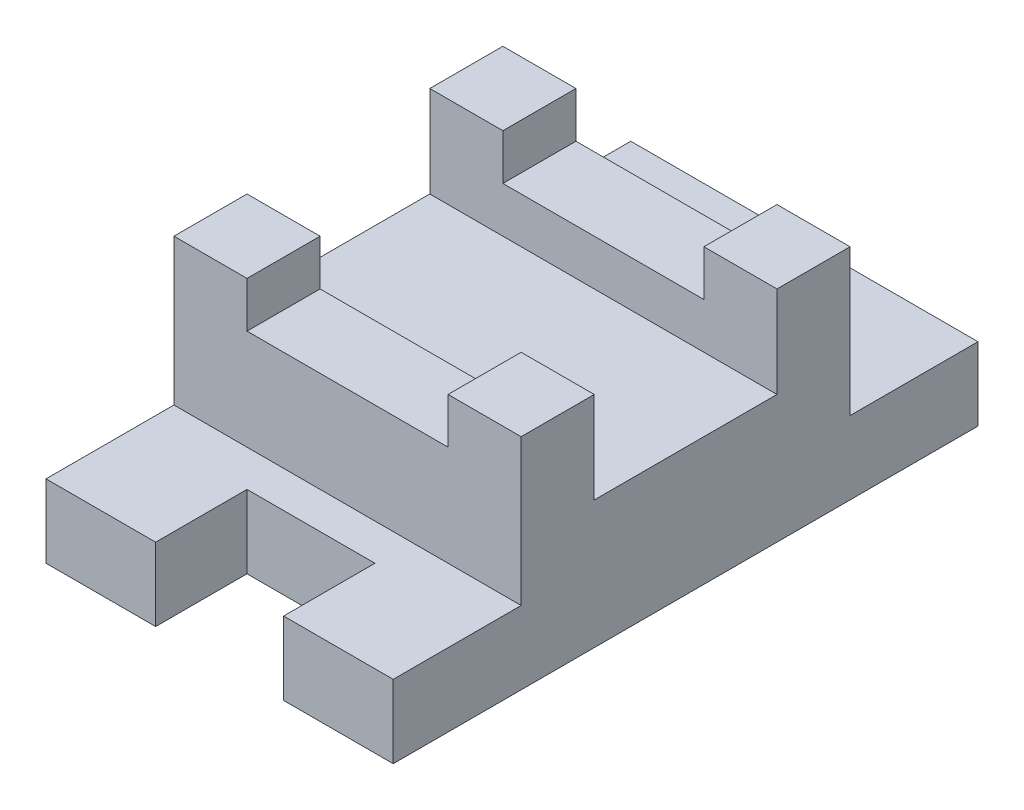
ISO-10303-21;
HEADER;
FILE_DESCRIPTION(('STEP AP214'),'2;1');
FILE_NAME('part.step','',(''),(''),'','','');
FILE_SCHEMA(('AUTOMOTIVE_DESIGN { 1 0 10303 214 1 1 1 1 }'));
ENDSEC;
DATA;
#1=APPLICATION_CONTEXT('core data for automotive mechanical design processes');
#2=APPLICATION_PROTOCOL_DEFINITION('international standard','automotive_design',2000,#1);
#3=PRODUCT_CONTEXT('',#1,'mechanical');
#4=PRODUCT('Part','Part','',(#3));
#5=PRODUCT_RELATED_PRODUCT_CATEGORY('part','',(#4));
#6=PRODUCT_DEFINITION_FORMATION('','',#4);
#7=PRODUCT_DEFINITION_CONTEXT('part definition',#1,'design');
#8=PRODUCT_DEFINITION('design','',#6,#7);
#9=PRODUCT_DEFINITION_SHAPE('','',#8);
#10=(LENGTH_UNIT() NAMED_UNIT(*) SI_UNIT(.MILLI.,.METRE.));
#11=(NAMED_UNIT(*) PLANE_ANGLE_UNIT() SI_UNIT($,.RADIAN.));
#12=(NAMED_UNIT(*) SI_UNIT($,.STERADIAN.) SOLID_ANGLE_UNIT());
#13=UNCERTAINTY_MEASURE_WITH_UNIT(LENGTH_MEASURE(1.E-05),#10,'distance_accuracy_value','');
#14=(GEOMETRIC_REPRESENTATION_CONTEXT(3) GLOBAL_UNCERTAINTY_ASSIGNED_CONTEXT((#13)) GLOBAL_UNIT_ASSIGNED_CONTEXT((#10,
#11,#12)) REPRESENTATION_CONTEXT('',''));
#15=CARTESIAN_POINT('',(0.,0.,0.));
#16=DIRECTION('',(0.,0.,1.));
#17=DIRECTION('',(1.,0.,0.));
#18=AXIS2_PLACEMENT_3D('',#15,#16,#17);
#19=CARTESIAN_POINT('',(38.,10.3750000000001,22.5));
#20=DIRECTION('',(0.,0.,-1.));
#21=DIRECTION('',(0.,1.,0.));
#22=AXIS2_PLACEMENT_3D('',#19,#20,#21);
#23=PLANE('',#22);
#24=DIRECTION('',(-1.,0.,0.));
#25=VECTOR('',#24,1.);
#26=CARTESIAN_POINT('',(38.,18.3750000000001,22.5));
#27=LINE('',#26,#25);
#28=CARTESIAN_POINT('',(38.,18.3750000000001,22.5));
#29=VERTEX_POINT('',#28);
#30=CARTESIAN_POINT('',(26.,18.3750000000001,22.5));
#31=VERTEX_POINT('',#30);
#32=EDGE_CURVE('E221',#29,#31,#27,.T.);
#33=ORIENTED_EDGE('',*,*,#32,.T.);
#34=DIRECTION('',(0.,-1.,0.));
#35=VECTOR('',#34,1.);
#36=CARTESIAN_POINT('',(26.,10.3750000000001,22.5));
#37=LINE('',#36,#35);
#38=CARTESIAN_POINT('',(26.,10.3750000000001,22.5));
#39=VERTEX_POINT('',#38);
#40=EDGE_CURVE('E649',#31,#39,#37,.T.);
#41=ORIENTED_EDGE('',*,*,#40,.T.);
#42=DIRECTION('',(-1.,0.,0.));
#43=VECTOR('',#42,1.);
#44=CARTESIAN_POINT('',(38.,10.3750000000001,22.5));
#45=LINE('',#44,#43);
#46=CARTESIAN_POINT('',(38.,10.3750000000001,22.5));
#47=VERTEX_POINT('',#46);
#48=EDGE_CURVE('E213',#47,#39,#45,.T.);
#49=ORIENTED_EDGE('',*,*,#48,.F.);
#50=DIRECTION('',(0.,-1.,0.));
#51=VECTOR('',#50,1.);
#52=CARTESIAN_POINT('',(38.,10.3750000000001,22.5));
#53=LINE('',#52,#51);
#54=EDGE_CURVE('E328',#29,#47,#53,.T.);
#55=ORIENTED_EDGE('',*,*,#54,.F.);
#56=EDGE_LOOP('',(#33,#41,#49,#55));
#57=FACE_BOUND('',#56,.T.);
#58=ADVANCED_FACE('F32',(#57),#23,.F.);
#59=CARTESIAN_POINT('',(38.,34.3750000000001,-19.5));
#60=DIRECTION('',(0.,-1.,0.));
#61=DIRECTION('',(0.,0.,-1.));
#62=AXIS2_PLACEMENT_3D('',#59,#60,#61);
#63=PLANE('',#62);
#64=DIRECTION('',(-1.,0.,0.));
#65=VECTOR('',#64,1.);
#66=CARTESIAN_POINT('',(38.,34.3750000000001,-19.5));
#67=LINE('',#66,#65);
#68=CARTESIAN_POINT('',(8.00000000000001,34.3750000000001,-19.5));
#69=VERTEX_POINT('',#68);
#70=CARTESIAN_POINT('',(0.,34.3750000000001,-19.5));
#71=VERTEX_POINT('',#70);
#72=EDGE_CURVE('E245',#69,#71,#67,.T.);
#73=ORIENTED_EDGE('',*,*,#72,.F.);
#74=DIRECTION('',(0.,0.,-1.));
#75=VECTOR('',#74,1.);
#76=CARTESIAN_POINT('',(8.00000000000001,34.3750000000001,-19.5));
#77=LINE('',#76,#75);
#78=CARTESIAN_POINT('',(8.00000000000001,34.3750000000001,-27.5));
#79=VERTEX_POINT('',#78);
#80=EDGE_CURVE('E421',#69,#79,#77,.T.);
#81=ORIENTED_EDGE('',*,*,#80,.T.);
#82=DIRECTION('',(-1.,0.,0.));
#83=VECTOR('',#82,1.);
#84=CARTESIAN_POINT('',(38.,34.3750000000001,-27.5));
#85=LINE('',#84,#83);
#86=CARTESIAN_POINT('',(0.,34.3750000000001,-27.5));
#87=VERTEX_POINT('',#86);
#88=EDGE_CURVE('E249',#79,#87,#85,.T.);
#89=ORIENTED_EDGE('',*,*,#88,.T.);
#90=DIRECTION('',(0.,0.,1.));
#91=VECTOR('',#90,1.);
#92=CARTESIAN_POINT('',(0.,34.3750000000001,-19.5));
#93=LINE('',#92,#91);
#94=EDGE_CURVE('E339',#87,#71,#93,.T.);
#95=ORIENTED_EDGE('',*,*,#94,.T.);
#96=EDGE_LOOP('',(#73,#81,#89,#95));
#97=FACE_BOUND('',#96,.T.);
#98=ADVANCED_FACE('F366',(#97),#63,.F.);
#99=CARTESIAN_POINT('',(38.,34.3750000000001,8.49999999999998));
#100=DIRECTION('',(0.,-1.,0.));
#101=DIRECTION('',(0.,0.,-1.));
#102=AXIS2_PLACEMENT_3D('',#99,#100,#101);
#103=PLANE('',#102);
#104=DIRECTION('',(-1.,0.,0.));
#105=VECTOR('',#104,1.);
#106=CARTESIAN_POINT('',(38.,34.3750000000001,8.49999999999998));
#107=LINE('',#106,#105);
#108=CARTESIAN_POINT('',(8.00000000000001,34.3750000000001,8.49999999999997));
#109=VERTEX_POINT('',#108);
#110=CARTESIAN_POINT('',(0.,34.3750000000001,8.49999999999998));
#111=VERTEX_POINT('',#110);
#112=EDGE_CURVE('E231',#109,#111,#107,.T.);
#113=ORIENTED_EDGE('',*,*,#112,.F.);
#114=DIRECTION('',(0.,0.,-1.));
#115=VECTOR('',#114,1.);
#116=CARTESIAN_POINT('',(8.00000000000001,34.3750000000001,8.49999999999998));
#117=LINE('',#116,#115);
#118=CARTESIAN_POINT('',(8.00000000000001,34.3750000000001,0.499999999999976));
#119=VERTEX_POINT('',#118);
#120=EDGE_CURVE('E273',#109,#119,#117,.T.);
#121=ORIENTED_EDGE('',*,*,#120,.T.);
#122=DIRECTION('',(-1.,0.,0.));
#123=VECTOR('',#122,1.);
#124=CARTESIAN_POINT('',(38.,34.3750000000001,0.499999999999976));
#125=LINE('',#124,#123);
#126=CARTESIAN_POINT('',(0.,34.3750000000001,0.499999999999976));
#127=VERTEX_POINT('',#126);
#128=EDGE_CURVE('E235',#119,#127,#125,.T.);
#129=ORIENTED_EDGE('',*,*,#128,.T.);
#130=DIRECTION('',(0.,0.,1.));
#131=VECTOR('',#130,1.);
#132=CARTESIAN_POINT('',(0.,34.3750000000001,8.49999999999998));
#133=LINE('',#132,#131);
#134=EDGE_CURVE('E276',#127,#111,#133,.T.);
#135=ORIENTED_EDGE('',*,*,#134,.T.);
#136=EDGE_LOOP('',(#113,#121,#129,#135));
#137=FACE_BOUND('',#136,.T.);
#138=ADVANCED_FACE('F272',(#137),#103,.F.);
#139=CARTESIAN_POINT('',(38.,18.3750000000001,-41.5));
#140=DIRECTION('',(0.,0.,1.));
#141=DIRECTION('',(1.,0.,0.));
#142=AXIS2_PLACEMENT_3D('',#139,#140,#141);
#143=PLANE('',#142);
#144=DIRECTION('',(0.,1.,0.));
#145=VECTOR('',#144,1.);
#146=CARTESIAN_POINT('',(0.,18.3750000000001,-41.5));
#147=LINE('',#146,#145);
#148=CARTESIAN_POINT('',(0.,10.3750000000001,-41.5));
#149=VERTEX_POINT('',#148);
#150=CARTESIAN_POINT('',(0.,18.3750000000001,-41.5));
#151=VERTEX_POINT('',#150);
#152=EDGE_CURVE('E331',#149,#151,#147,.T.);
#153=ORIENTED_EDGE('',*,*,#152,.T.);
#154=DIRECTION('',(-1.,0.,0.));
#155=VECTOR('',#154,1.);
#156=CARTESIAN_POINT('',(38.,18.3750000000001,-41.5));
#157=LINE('',#156,#155);
#158=CARTESIAN_POINT('',(38.,18.3750000000001,-41.5));
#159=VERTEX_POINT('',#158);
#160=EDGE_CURVE('E256',#159,#151,#157,.T.);
#161=ORIENTED_EDGE('',*,*,#160,.F.);
#162=DIRECTION('',(0.,1.,0.));
#163=VECTOR('',#162,1.);
#164=CARTESIAN_POINT('',(38.,18.3750000000001,-41.5));
#165=LINE('',#164,#163);
#166=CARTESIAN_POINT('',(38.,10.3750000000001,-41.5));
#167=VERTEX_POINT('',#166);
#168=EDGE_CURVE('E298',#167,#159,#165,.T.);
#169=ORIENTED_EDGE('',*,*,#168,.F.);
#170=DIRECTION('',(-1.,0.,0.));
#171=VECTOR('',#170,1.);
#172=CARTESIAN_POINT('',(38.,10.3750000000001,-41.5));
#173=LINE('',#172,#171);
#174=EDGE_CURVE('E223',#167,#149,#173,.T.);
#175=ORIENTED_EDGE('',*,*,#174,.T.);
#176=EDGE_LOOP('',(#153,#161,#169,#175));
#177=FACE_BOUND('',#176,.T.);
#178=ADVANCED_FACE('F34',(#177),#143,.F.);
#179=CARTESIAN_POINT('',(38.,18.3750000000001,-27.5));
#180=DIRECTION('',(0.,-1.,0.));
#181=DIRECTION('',(0.,0.,-1.));
#182=AXIS2_PLACEMENT_3D('',#179,#180,#181);
#183=PLANE('',#182);
#184=DIRECTION('',(0.,0.,1.));
#185=VECTOR('',#184,1.);
#186=CARTESIAN_POINT('',(0.,18.3750000000001,-27.5));
#187=LINE('',#186,#185);
#188=CARTESIAN_POINT('',(0.,18.3750000000001,-27.5));
#189=VERTEX_POINT('',#188);
#190=EDGE_CURVE('E334',#151,#189,#187,.T.);
#191=ORIENTED_EDGE('',*,*,#190,.T.);
#192=DIRECTION('',(-1.,0.,0.));
#193=VECTOR('',#192,1.);
#194=CARTESIAN_POINT('',(38.,18.3750000000001,-27.5));
#195=LINE('',#194,#193);
#196=CARTESIAN_POINT('',(38.,18.3750000000001,-27.5));
#197=VERTEX_POINT('',#196);
#198=EDGE_CURVE('E253',#197,#189,#195,.T.);
#199=ORIENTED_EDGE('',*,*,#198,.F.);
#200=DIRECTION('',(0.,0.,1.));
#201=VECTOR('',#200,1.);
#202=CARTESIAN_POINT('',(38.,18.3750000000001,-27.5));
#203=LINE('',#202,#201);
#204=EDGE_CURVE('E302',#159,#197,#203,.T.);
#205=ORIENTED_EDGE('',*,*,#204,.F.);
#206=ORIENTED_EDGE('',*,*,#160,.T.);
#207=EDGE_LOOP('',(#191,#199,#205,#206));
#208=FACE_BOUND('',#207,.T.);
#209=ADVANCED_FACE('F376',(#208),#183,.F.);
#210=CARTESIAN_POINT('',(38.,34.3750000000001,-27.5));
#211=DIRECTION('',(0.,0.,1.));
#212=DIRECTION('',(1.,0.,0.));
#213=AXIS2_PLACEMENT_3D('',#210,#211,#212);
#214=PLANE('',#213);
#215=ORIENTED_EDGE('',*,*,#88,.F.);
#216=DIRECTION('',(0.,-1.,0.));
#217=VECTOR('',#216,1.);
#218=CARTESIAN_POINT('',(8.00000000000001,34.3750000000001,-27.5));
#219=LINE('',#218,#217);
#220=CARTESIAN_POINT('',(8.00000000000001,29.3750000000001,-27.5));
#221=VERTEX_POINT('',#220);
#222=EDGE_CURVE('E310',#79,#221,#219,.T.);
#223=ORIENTED_EDGE('',*,*,#222,.T.);
#224=DIRECTION('',(1.,0.,0.));
#225=VECTOR('',#224,1.);
#226=CARTESIAN_POINT('',(38.,29.3750000000001,-27.5));
#227=LINE('',#226,#225);
#228=CARTESIAN_POINT('',(30.,29.3750000000001,-27.5));
#229=VERTEX_POINT('',#228);
#230=EDGE_CURVE('E401',#221,#229,#227,.T.);
#231=ORIENTED_EDGE('',*,*,#230,.T.);
#232=DIRECTION('',(0.,1.,0.));
#233=VECTOR('',#232,1.);
#234=CARTESIAN_POINT('',(30.,34.3750000000001,-27.5));
#235=LINE('',#234,#233);
#236=CARTESIAN_POINT('',(30.,34.3750000000001,-27.5));
#237=VERTEX_POINT('',#236);
#238=EDGE_CURVE('E415',#229,#237,#235,.T.);
#239=ORIENTED_EDGE('',*,*,#238,.T.);
#240=CARTESIAN_POINT('',(38.,34.3750000000001,-27.5));
#241=VERTEX_POINT('',#240);
#242=EDGE_CURVE('E250',#241,#237,#85,.T.);
#243=ORIENTED_EDGE('',*,*,#242,.F.);
#244=DIRECTION('',(0.,1.,0.));
#245=VECTOR('',#244,1.);
#246=CARTESIAN_POINT('',(38.,34.3750000000001,-27.5));
#247=LINE('',#246,#245);
#248=EDGE_CURVE('E307',#197,#241,#247,.T.);
#249=ORIENTED_EDGE('',*,*,#248,.F.);
#250=ORIENTED_EDGE('',*,*,#198,.T.);
#251=DIRECTION('',(0.,1.,0.));
#252=VECTOR('',#251,1.);
#253=CARTESIAN_POINT('',(0.,34.3750000000001,-27.5));
#254=LINE('',#253,#252);
#255=EDGE_CURVE('E336',#189,#87,#254,.T.);
#256=ORIENTED_EDGE('',*,*,#255,.T.);
#257=EDGE_LOOP('',(#215,#223,#231,#239,#243,#249,#250,#256));
#258=FACE_BOUND('',#257,.T.);
#259=ADVANCED_FACE('F370',(#258),#214,.F.);
#260=ORIENTED_EDGE('',*,*,#242,.T.);
#261=DIRECTION('',(0.,0.,1.));
#262=VECTOR('',#261,1.);
#263=CARTESIAN_POINT('',(30.,34.3750000000001,-19.5));
#264=LINE('',#263,#262);
#265=CARTESIAN_POINT('',(30.,34.3750000000001,-19.5));
#266=VERTEX_POINT('',#265);
#267=EDGE_CURVE('E412',#237,#266,#264,.T.);
#268=ORIENTED_EDGE('',*,*,#267,.T.);
#269=CARTESIAN_POINT('',(38.,34.3750000000001,-19.5));
#270=VERTEX_POINT('',#269);
#271=EDGE_CURVE('E246',#270,#266,#67,.T.);
#272=ORIENTED_EDGE('',*,*,#271,.F.);
#273=DIRECTION('',(0.,0.,1.));
#274=VECTOR('',#273,1.);
#275=CARTESIAN_POINT('',(38.,34.3750000000001,-19.5));
#276=LINE('',#275,#274);
#277=EDGE_CURVE('E314',#241,#270,#276,.T.);
#278=ORIENTED_EDGE('',*,*,#277,.F.);
#279=EDGE_LOOP('',(#260,#268,#272,#278));
#280=FACE_BOUND('',#279,.T.);
#281=ADVANCED_FACE('F441',(#280),#63,.F.);
#282=CARTESIAN_POINT('',(38.,24.3750000000001,-19.5));
#283=DIRECTION('',(0.,0.,-1.));
#284=DIRECTION('',(-1.,0.,0.));
#285=AXIS2_PLACEMENT_3D('',#282,#283,#284);
#286=PLANE('',#285);
#287=DIRECTION('',(-1.,0.,0.));
#288=VECTOR('',#287,1.);
#289=CARTESIAN_POINT('',(38.,29.3750000000001,-19.5));
#290=LINE('',#289,#288);
#291=CARTESIAN_POINT('',(30.,29.3750000000001,-19.5));
#292=VERTEX_POINT('',#291);
#293=CARTESIAN_POINT('',(8.00000000000001,29.3750000000001,-19.5));
#294=VERTEX_POINT('',#293);
#295=EDGE_CURVE('E406',#292,#294,#290,.T.);
#296=ORIENTED_EDGE('',*,*,#295,.T.);
#297=DIRECTION('',(0.,1.,0.));
#298=VECTOR('',#297,1.);
#299=CARTESIAN_POINT('',(8.00000000000001,24.3750000000001,-19.5));
#300=LINE('',#299,#298);
#301=EDGE_CURVE('E363',#294,#69,#300,.T.);
#302=ORIENTED_EDGE('',*,*,#301,.T.);
#303=ORIENTED_EDGE('',*,*,#72,.T.);
#304=DIRECTION('',(0.,-1.,0.));
#305=VECTOR('',#304,1.);
#306=CARTESIAN_POINT('',(0.,24.3750000000001,-19.5));
#307=LINE('',#306,#305);
#308=CARTESIAN_POINT('',(0.,24.3750000000001,-19.5));
#309=VERTEX_POINT('',#308);
#310=EDGE_CURVE('E342',#71,#309,#307,.T.);
#311=ORIENTED_EDGE('',*,*,#310,.T.);
#312=DIRECTION('',(-1.,0.,0.));
#313=VECTOR('',#312,1.);
#314=CARTESIAN_POINT('',(38.,24.3750000000001,-19.5));
#315=LINE('',#314,#313);
#316=CARTESIAN_POINT('',(38.,24.3750000000001,-19.5));
#317=VERTEX_POINT('',#316);
#318=EDGE_CURVE('E242',#317,#309,#315,.T.);
#319=ORIENTED_EDGE('',*,*,#318,.F.);
#320=DIRECTION('',(0.,-1.,0.));
#321=VECTOR('',#320,1.);
#322=CARTESIAN_POINT('',(38.,24.3750000000001,-19.5));
#323=LINE('',#322,#321);
#324=EDGE_CURVE('E316',#270,#317,#323,.T.);
#325=ORIENTED_EDGE('',*,*,#324,.F.);
#326=ORIENTED_EDGE('',*,*,#271,.T.);
#327=DIRECTION('',(0.,-1.,0.));
#328=VECTOR('',#327,1.);
#329=CARTESIAN_POINT('',(30.,24.3750000000001,-19.5));
#330=LINE('',#329,#328);
#331=EDGE_CURVE('E403',#266,#292,#330,.T.);
#332=ORIENTED_EDGE('',*,*,#331,.T.);
#333=EDGE_LOOP('',(#296,#302,#303,#311,#319,#325,#326,#332));
#334=FACE_BOUND('',#333,.T.);
#335=ADVANCED_FACE('F360',(#334),#286,.F.);
#336=CARTESIAN_POINT('',(38.,24.3750000000001,0.499999999999976));
#337=DIRECTION('',(0.,-1.,0.));
#338=DIRECTION('',(0.,0.,-1.));
#339=AXIS2_PLACEMENT_3D('',#336,#337,#338);
#340=PLANE('',#339);
#341=DIRECTION('',(0.,0.,1.));
#342=VECTOR('',#341,1.);
#343=CARTESIAN_POINT('',(0.,24.3750000000001,0.499999999999976));
#344=LINE('',#343,#342);
#345=CARTESIAN_POINT('',(0.,24.3750000000001,0.499999999999976));
#346=VERTEX_POINT('',#345);
#347=EDGE_CURVE('E344',#309,#346,#344,.T.);
#348=ORIENTED_EDGE('',*,*,#347,.T.);
#349=DIRECTION('',(-1.,0.,0.));
#350=VECTOR('',#349,1.);
#351=CARTESIAN_POINT('',(38.,24.3750000000001,0.499999999999976));
#352=LINE('',#351,#350);
#353=CARTESIAN_POINT('',(38.,24.3750000000001,0.499999999999976));
#354=VERTEX_POINT('',#353);
#355=EDGE_CURVE('E239',#354,#346,#352,.T.);
#356=ORIENTED_EDGE('',*,*,#355,.F.);
#357=DIRECTION('',(0.,0.,1.));
#358=VECTOR('',#357,1.);
#359=CARTESIAN_POINT('',(38.,24.3750000000001,0.499999999999976));
#360=LINE('',#359,#358);
#361=EDGE_CURVE('E318',#317,#354,#360,.T.);
#362=ORIENTED_EDGE('',*,*,#361,.F.);
#363=ORIENTED_EDGE('',*,*,#318,.T.);
#364=EDGE_LOOP('',(#348,#356,#362,#363));
#365=FACE_BOUND('',#364,.T.);
#366=ADVANCED_FACE('F354',(#365),#340,.F.);
#367=CARTESIAN_POINT('',(38.,34.3750000000001,0.499999999999976));
#368=DIRECTION('',(0.,0.,1.));
#369=DIRECTION('',(1.,0.,0.));
#370=AXIS2_PLACEMENT_3D('',#367,#368,#369);
#371=PLANE('',#370);
#372=ORIENTED_EDGE('',*,*,#128,.F.);
#373=DIRECTION('',(0.,-1.,0.));
#374=VECTOR('',#373,1.);
#375=CARTESIAN_POINT('',(8.00000000000001,34.3750000000001,0.499999999999976));
#376=LINE('',#375,#374);
#377=CARTESIAN_POINT('',(8.00000000000001,29.3750000000001,0.499999999999959));
#378=VERTEX_POINT('',#377);
#379=EDGE_CURVE('E419',#119,#378,#376,.T.);
#380=ORIENTED_EDGE('',*,*,#379,.T.);
#381=DIRECTION('',(1.,0.,0.));
#382=VECTOR('',#381,1.);
#383=CARTESIAN_POINT('',(38.,29.3750000000001,0.499999999999976));
#384=LINE('',#383,#382);
#385=CARTESIAN_POINT('',(30.,29.3750000000001,0.499999999999959));
#386=VERTEX_POINT('',#385);
#387=EDGE_CURVE('E432',#378,#386,#384,.T.);
#388=ORIENTED_EDGE('',*,*,#387,.T.);
#389=DIRECTION('',(0.,1.,0.));
#390=VECTOR('',#389,1.);
#391=CARTESIAN_POINT('',(30.,34.3750000000001,0.499999999999976));
#392=LINE('',#391,#390);
#393=CARTESIAN_POINT('',(30.,34.3750000000001,0.499999999999976));
#394=VERTEX_POINT('',#393);
#395=EDGE_CURVE('E400',#386,#394,#392,.T.);
#396=ORIENTED_EDGE('',*,*,#395,.T.);
#397=CARTESIAN_POINT('',(38.,34.3750000000001,0.499999999999976));
#398=VERTEX_POINT('',#397);
#399=EDGE_CURVE('E236',#398,#394,#125,.T.);
#400=ORIENTED_EDGE('',*,*,#399,.F.);
#401=DIRECTION('',(0.,1.,0.));
#402=VECTOR('',#401,1.);
#403=CARTESIAN_POINT('',(38.,34.3750000000001,0.499999999999976));
#404=LINE('',#403,#402);
#405=EDGE_CURVE('E320',#354,#398,#404,.T.);
#406=ORIENTED_EDGE('',*,*,#405,.F.);
#407=ORIENTED_EDGE('',*,*,#355,.T.);
#408=DIRECTION('',(0.,1.,0.));
#409=VECTOR('',#408,1.);
#410=CARTESIAN_POINT('',(0.,34.3750000000001,0.499999999999976));
#411=LINE('',#410,#409);
#412=EDGE_CURVE('E282',#346,#127,#411,.T.);
#413=ORIENTED_EDGE('',*,*,#412,.T.);
#414=EDGE_LOOP('',(#372,#380,#388,#396,#400,#406,#407,#413));
#415=FACE_BOUND('',#414,.T.);
#416=ADVANCED_FACE('F346',(#415),#371,.F.);
#417=ORIENTED_EDGE('',*,*,#399,.T.);
#418=DIRECTION('',(0.,0.,1.));
#419=VECTOR('',#418,1.);
#420=CARTESIAN_POINT('',(30.,34.3750000000001,8.49999999999998));
#421=LINE('',#420,#419);
#422=CARTESIAN_POINT('',(30.,34.3750000000001,8.49999999999997));
#423=VERTEX_POINT('',#422);
#424=EDGE_CURVE('E397',#394,#423,#421,.T.);
#425=ORIENTED_EDGE('',*,*,#424,.T.);
#426=CARTESIAN_POINT('',(38.,34.3750000000001,8.49999999999998));
#427=VERTEX_POINT('',#426);
#428=EDGE_CURVE('E232',#427,#423,#107,.T.);
#429=ORIENTED_EDGE('',*,*,#428,.F.);
#430=DIRECTION('',(0.,0.,1.));
#431=VECTOR('',#430,1.);
#432=CARTESIAN_POINT('',(38.,34.3750000000001,8.49999999999998));
#433=LINE('',#432,#431);
#434=EDGE_CURVE('E322',#398,#427,#433,.T.);
#435=ORIENTED_EDGE('',*,*,#434,.F.);
#436=EDGE_LOOP('',(#417,#425,#429,#435));
#437=FACE_BOUND('',#436,.T.);
#438=ADVANCED_FACE('F396',(#437),#103,.F.);
#439=CARTESIAN_POINT('',(38.,18.3750000000001,8.49999999999998));
#440=DIRECTION('',(0.,0.,-1.));
#441=DIRECTION('',(0.,1.,0.));
#442=AXIS2_PLACEMENT_3D('',#439,#440,#441);
#443=PLANE('',#442);
#444=DIRECTION('',(1.,0.,0.));
#445=VECTOR('',#444,1.);
#446=CARTESIAN_POINT('',(30.,29.3750000000001,8.49999999999997));
#447=LINE('',#446,#445);
#448=CARTESIAN_POINT('',(8.00000000000001,29.3750000000001,8.49999999999998));
#449=VERTEX_POINT('',#448);
#450=CARTESIAN_POINT('',(30.,29.3750000000001,8.49999999999997));
#451=VERTEX_POINT('',#450);
#452=EDGE_CURVE('E267',#449,#451,#447,.T.);
#453=ORIENTED_EDGE('',*,*,#452,.F.);
#454=DIRECTION('',(0.,1.,0.));
#455=VECTOR('',#454,1.);
#456=CARTESIAN_POINT('',(8.00000000000001,18.3750000000001,8.49999999999998));
#457=LINE('',#456,#455);
#458=EDGE_CURVE('E40',#449,#109,#457,.T.);
#459=ORIENTED_EDGE('',*,*,#458,.T.);
#460=ORIENTED_EDGE('',*,*,#112,.T.);
#461=DIRECTION('',(0.,-1.,0.));
#462=VECTOR('',#461,1.);
#463=CARTESIAN_POINT('',(0.,18.3750000000001,8.49999999999998));
#464=LINE('',#463,#462);
#465=CARTESIAN_POINT('',(0.,18.3750000000001,8.49999999999998));
#466=VERTEX_POINT('',#465);
#467=EDGE_CURVE('E281',#111,#466,#464,.T.);
#468=ORIENTED_EDGE('',*,*,#467,.T.);
#469=DIRECTION('',(-1.,0.,0.));
#470=VECTOR('',#469,1.);
#471=CARTESIAN_POINT('',(38.,18.3750000000001,8.49999999999998));
#472=LINE('',#471,#470);
#473=CARTESIAN_POINT('',(38.,18.3750000000001,8.49999999999998));
#474=VERTEX_POINT('',#473);
#475=EDGE_CURVE('E228',#474,#466,#472,.T.);
#476=ORIENTED_EDGE('',*,*,#475,.F.);
#477=DIRECTION('',(0.,-1.,0.));
#478=VECTOR('',#477,1.);
#479=CARTESIAN_POINT('',(38.,18.3750000000001,8.49999999999998));
#480=LINE('',#479,#478);
#481=EDGE_CURVE('E324',#427,#474,#480,.T.);
#482=ORIENTED_EDGE('',*,*,#481,.F.);
#483=ORIENTED_EDGE('',*,*,#428,.T.);
#484=DIRECTION('',(0.,1.,0.));
#485=VECTOR('',#484,1.);
#486=CARTESIAN_POINT('',(30.,39.3750000000001,8.49999999999997));
#487=LINE('',#486,#485);
#488=EDGE_CURVE('E429',#451,#423,#487,.T.);
#489=ORIENTED_EDGE('',*,*,#488,.F.);
#490=EDGE_LOOP('',(#453,#459,#460,#468,#476,#482,#483,#489));
#491=FACE_BOUND('',#490,.T.);
#492=ADVANCED_FACE('F263',(#491),#443,.F.);
#493=CARTESIAN_POINT('',(38.,18.3750000000001,22.5));
#494=DIRECTION('',(0.,-1.,0.));
#495=DIRECTION('',(0.,0.,-1.));
#496=AXIS2_PLACEMENT_3D('',#493,#494,#495);
#497=PLANE('',#496);
#498=DIRECTION('',(-1.,0.,0.));
#499=VECTOR('',#498,1.);
#500=CARTESIAN_POINT('',(12.,18.3750000000001,12.5));
#501=LINE('',#500,#499);
#502=CARTESIAN_POINT('',(26.,18.3750000000001,12.5));
#503=VERTEX_POINT('',#502);
#504=CARTESIAN_POINT('',(12.,18.3750000000001,12.5));
#505=VERTEX_POINT('',#504);
#506=EDGE_CURVE('E656',#503,#505,#501,.T.);
#507=ORIENTED_EDGE('',*,*,#506,.F.);
#508=DIRECTION('',(0.,0.,-1.));
#509=VECTOR('',#508,1.);
#510=CARTESIAN_POINT('',(26.,18.3750000000001,32.5));
#511=LINE('',#510,#509);
#512=EDGE_CURVE('E197',#31,#503,#511,.T.);
#513=ORIENTED_EDGE('',*,*,#512,.F.);
#514=ORIENTED_EDGE('',*,*,#32,.F.);
#515=DIRECTION('',(0.,0.,1.));
#516=VECTOR('',#515,1.);
#517=CARTESIAN_POINT('',(38.,18.3750000000001,22.5));
#518=LINE('',#517,#516);
#519=EDGE_CURVE('E326',#474,#29,#518,.T.);
#520=ORIENTED_EDGE('',*,*,#519,.F.);
#521=ORIENTED_EDGE('',*,*,#475,.T.);
#522=DIRECTION('',(0.,0.,1.));
#523=VECTOR('',#522,1.);
#524=CARTESIAN_POINT('',(0.,18.3750000000001,22.5));
#525=LINE('',#524,#523);
#526=CARTESIAN_POINT('',(0.,18.3750000000001,22.5));
#527=VERTEX_POINT('',#526);
#528=EDGE_CURVE('E289',#466,#527,#525,.T.);
#529=ORIENTED_EDGE('',*,*,#528,.T.);
#530=CARTESIAN_POINT('',(12.,18.3750000000001,22.5));
#531=VERTEX_POINT('',#530);
#532=EDGE_CURVE('E218',#531,#527,#27,.T.);
#533=ORIENTED_EDGE('',*,*,#532,.F.);
#534=DIRECTION('',(0.,0.,1.));
#535=VECTOR('',#534,1.);
#536=CARTESIAN_POINT('',(12.,18.3750000000001,32.5));
#537=LINE('',#536,#535);
#538=EDGE_CURVE('E207',#505,#531,#537,.T.);
#539=ORIENTED_EDGE('',*,*,#538,.F.);
#540=EDGE_LOOP('',(#507,#513,#514,#520,#521,#529,#533,#539));
#541=FACE_BOUND('',#540,.T.);
#542=ADVANCED_FACE('F386',(#541),#497,.F.);
#543=CARTESIAN_POINT('',(12.,10.3750000000001,22.5));
#544=VERTEX_POINT('',#543);
#545=CARTESIAN_POINT('',(0.,10.3750000000001,22.5));
#546=VERTEX_POINT('',#545);
#547=EDGE_CURVE('E219',#544,#546,#45,.T.);
#548=ORIENTED_EDGE('',*,*,#547,.F.);
#549=DIRECTION('',(0.,1.,0.));
#550=VECTOR('',#549,1.);
#551=CARTESIAN_POINT('',(12.,10.3750000000001,22.5));
#552=LINE('',#551,#550);
#553=EDGE_CURVE('E383',#544,#531,#552,.T.);
#554=ORIENTED_EDGE('',*,*,#553,.T.);
#555=ORIENTED_EDGE('',*,*,#532,.T.);
#556=DIRECTION('',(0.,-1.,0.));
#557=VECTOR('',#556,1.);
#558=CARTESIAN_POINT('',(0.,10.3750000000001,22.5));
#559=LINE('',#558,#557);
#560=EDGE_CURVE('E292',#527,#546,#559,.T.);
#561=ORIENTED_EDGE('',*,*,#560,.T.);
#562=EDGE_LOOP('',(#548,#554,#555,#561));
#563=FACE_BOUND('',#562,.T.);
#564=ADVANCED_FACE('F380',(#563),#23,.F.);
#565=CARTESIAN_POINT('',(38.,10.3750000000001,-41.5));
#566=DIRECTION('',(0.,1.,0.));
#567=DIRECTION('',(0.,0.,1.));
#568=AXIS2_PLACEMENT_3D('',#565,#566,#567);
#569=PLANE('',#568);
#570=ORIENTED_EDGE('',*,*,#48,.T.);
#571=DIRECTION('',(0.,0.,-1.));
#572=VECTOR('',#571,1.);
#573=CARTESIAN_POINT('',(26.,10.3750000000001,-41.5));
#574=LINE('',#573,#572);
#575=CARTESIAN_POINT('',(26.,10.3750000000001,12.5));
#576=VERTEX_POINT('',#575);
#577=EDGE_CURVE('E11',#39,#576,#574,.T.);
#578=ORIENTED_EDGE('',*,*,#577,.T.);
#579=DIRECTION('',(-1.,0.,0.));
#580=VECTOR('',#579,1.);
#581=CARTESIAN_POINT('',(12.,10.3750000000001,12.5));
#582=LINE('',#581,#580);
#583=CARTESIAN_POINT('',(12.,10.3750000000001,12.5));
#584=VERTEX_POINT('',#583);
#585=EDGE_CURVE('E204',#576,#584,#582,.T.);
#586=ORIENTED_EDGE('',*,*,#585,.T.);
#587=DIRECTION('',(0.,0.,1.));
#588=VECTOR('',#587,1.);
#589=CARTESIAN_POINT('',(12.,10.3750000000001,32.5));
#590=LINE('',#589,#588);
#591=EDGE_CURVE('E47',#584,#544,#590,.T.);
#592=ORIENTED_EDGE('',*,*,#591,.T.);
#593=ORIENTED_EDGE('',*,*,#547,.T.);
#594=DIRECTION('',(0.,0.,-1.));
#595=VECTOR('',#594,1.);
#596=CARTESIAN_POINT('',(0.,10.3750000000001,-41.5));
#597=LINE('',#596,#595);
#598=EDGE_CURVE('E297',#546,#149,#597,.T.);
#599=ORIENTED_EDGE('',*,*,#598,.T.);
#600=ORIENTED_EDGE('',*,*,#174,.F.);
#601=DIRECTION('',(0.,0.,-1.));
#602=VECTOR('',#601,1.);
#603=CARTESIAN_POINT('',(38.,10.3750000000001,-41.5));
#604=LINE('',#603,#602);
#605=EDGE_CURVE('E215',#47,#167,#604,.T.);
#606=ORIENTED_EDGE('',*,*,#605,.F.);
#607=EDGE_LOOP('',(#570,#578,#586,#592,#593,#599,#600,#606));
#608=FACE_BOUND('',#607,.T.);
#609=ADVANCED_FACE('F210',(#608),#569,.F.);
#610=CARTESIAN_POINT('',(38.,0.,0.));
#611=DIRECTION('',(-1.,0.,0.));
#612=DIRECTION('',(0.,0.,1.));
#613=AXIS2_PLACEMENT_3D('',#610,#611,#612);
#614=PLANE('',#613);
#615=ORIENTED_EDGE('',*,*,#168,.T.);
#616=ORIENTED_EDGE('',*,*,#204,.T.);
#617=ORIENTED_EDGE('',*,*,#248,.T.);
#618=ORIENTED_EDGE('',*,*,#277,.T.);
#619=ORIENTED_EDGE('',*,*,#324,.T.);
#620=ORIENTED_EDGE('',*,*,#361,.T.);
#621=ORIENTED_EDGE('',*,*,#405,.T.);
#622=ORIENTED_EDGE('',*,*,#434,.T.);
#623=ORIENTED_EDGE('',*,*,#481,.T.);
#624=ORIENTED_EDGE('',*,*,#519,.T.);
#625=ORIENTED_EDGE('',*,*,#54,.T.);
#626=ORIENTED_EDGE('',*,*,#605,.T.);
#627=EDGE_LOOP('',(#615,#616,#617,#618,#619,#620,#621,#622,#623,#624,#625,#626));
#628=FACE_BOUND('',#627,.T.);
#629=ADVANCED_FACE('F391',(#628),#614,.F.);
#630=CARTESIAN_POINT('',(0.,0.,0.));
#631=DIRECTION('',(-1.,0.,0.));
#632=DIRECTION('',(0.,0.,1.));
#633=AXIS2_PLACEMENT_3D('',#630,#631,#632);
#634=PLANE('',#633);
#635=ORIENTED_EDGE('',*,*,#152,.F.);
#636=ORIENTED_EDGE('',*,*,#598,.F.);
#637=ORIENTED_EDGE('',*,*,#560,.F.);
#638=ORIENTED_EDGE('',*,*,#528,.F.);
#639=ORIENTED_EDGE('',*,*,#467,.F.);
#640=ORIENTED_EDGE('',*,*,#134,.F.);
#641=ORIENTED_EDGE('',*,*,#412,.F.);
#642=ORIENTED_EDGE('',*,*,#347,.F.);
#643=ORIENTED_EDGE('',*,*,#310,.F.);
#644=ORIENTED_EDGE('',*,*,#94,.F.);
#645=ORIENTED_EDGE('',*,*,#255,.F.);
#646=ORIENTED_EDGE('',*,*,#190,.F.);
#647=EDGE_LOOP('',(#635,#636,#637,#638,#639,#640,#641,#642,#643,#644,#645,#646));
#648=FACE_BOUND('',#647,.T.);
#649=ADVANCED_FACE('F286',(#648),#634,.T.);
#650=CARTESIAN_POINT('',(30.,29.3750000000001,-41.5));
#651=DIRECTION('',(0.,-1.,0.));
#652=DIRECTION('',(0.,0.,-1.));
#653=AXIS2_PLACEMENT_3D('',#650,#651,#652);
#654=PLANE('',#653);
#655=DIRECTION('',(0.,0.,1.));
#656=VECTOR('',#655,1.);
#657=CARTESIAN_POINT('',(8.00000000000001,29.3750000000001,-41.5));
#658=LINE('',#657,#656);
#659=EDGE_CURVE('E425',#378,#449,#658,.T.);
#660=ORIENTED_EDGE('',*,*,#659,.T.);
#661=ORIENTED_EDGE('',*,*,#452,.T.);
#662=DIRECTION('',(0.,0.,1.));
#663=VECTOR('',#662,1.);
#664=CARTESIAN_POINT('',(30.,29.3750000000001,-41.5));
#665=LINE('',#664,#663);
#666=EDGE_CURVE('E424',#386,#451,#665,.T.);
#667=ORIENTED_EDGE('',*,*,#666,.F.);
#668=ORIENTED_EDGE('',*,*,#387,.F.);
#669=EDGE_LOOP('',(#660,#661,#667,#668));
#670=FACE_BOUND('',#669,.T.);
#671=ADVANCED_FACE('F497',(#670),#654,.F.);
#672=CARTESIAN_POINT('',(30.,39.3750000000001,-41.5));
#673=DIRECTION('',(1.,0.,0.));
#674=DIRECTION('',(0.,0.,-1.));
#675=AXIS2_PLACEMENT_3D('',#672,#673,#674);
#676=PLANE('',#675);
#677=ORIENTED_EDGE('',*,*,#666,.T.);
#678=ORIENTED_EDGE('',*,*,#488,.T.);
#679=ORIENTED_EDGE('',*,*,#424,.F.);
#680=ORIENTED_EDGE('',*,*,#395,.F.);
#681=EDGE_LOOP('',(#677,#678,#679,#680));
#682=FACE_BOUND('',#681,.T.);
#683=ADVANCED_FACE('F502',(#682),#676,.F.);
#684=CARTESIAN_POINT('',(8.00000000000001,39.3750000000001,-41.5));
#685=DIRECTION('',(-1.,0.,0.));
#686=DIRECTION('',(0.,0.,1.));
#687=AXIS2_PLACEMENT_3D('',#684,#685,#686);
#688=PLANE('',#687);
#689=ORIENTED_EDGE('',*,*,#120,.F.);
#690=ORIENTED_EDGE('',*,*,#458,.F.);
#691=ORIENTED_EDGE('',*,*,#659,.F.);
#692=ORIENTED_EDGE('',*,*,#379,.F.);
#693=EDGE_LOOP('',(#689,#690,#691,#692));
#694=FACE_BOUND('',#693,.T.);
#695=ADVANCED_FACE('F514',(#694),#688,.F.);
#696=ORIENTED_EDGE('',*,*,#80,.F.);
#697=ORIENTED_EDGE('',*,*,#301,.F.);
#698=EDGE_CURVE('E55',#221,#294,#658,.T.);
#699=ORIENTED_EDGE('',*,*,#698,.F.);
#700=ORIENTED_EDGE('',*,*,#222,.F.);
#701=EDGE_LOOP('',(#696,#697,#699,#700));
#702=FACE_BOUND('',#701,.T.);
#703=ADVANCED_FACE('F423',(#702),#688,.F.);
#704=EDGE_CURVE('E427',#229,#292,#665,.T.);
#705=ORIENTED_EDGE('',*,*,#704,.T.);
#706=ORIENTED_EDGE('',*,*,#331,.F.);
#707=ORIENTED_EDGE('',*,*,#267,.F.);
#708=ORIENTED_EDGE('',*,*,#238,.F.);
#709=EDGE_LOOP('',(#705,#706,#707,#708));
#710=FACE_BOUND('',#709,.T.);
#711=ADVANCED_FACE('F438',(#710),#676,.F.);
#712=ORIENTED_EDGE('',*,*,#698,.T.);
#713=ORIENTED_EDGE('',*,*,#295,.F.);
#714=ORIENTED_EDGE('',*,*,#704,.F.);
#715=ORIENTED_EDGE('',*,*,#230,.F.);
#716=EDGE_LOOP('',(#712,#713,#714,#715));
#717=FACE_BOUND('',#716,.T.);
#718=ADVANCED_FACE('F436',(#717),#654,.F.);
#719=CARTESIAN_POINT('',(26.,10.3750000000001,32.5));
#720=DIRECTION('',(1.,0.,0.));
#721=DIRECTION('',(0.,0.,-1.));
#722=AXIS2_PLACEMENT_3D('',#719,#720,#721);
#723=PLANE('',#722);
#724=ORIENTED_EDGE('',*,*,#512,.T.);
#725=DIRECTION('',(0.,1.,0.));
#726=VECTOR('',#725,1.);
#727=CARTESIAN_POINT('',(26.,10.3750000000001,12.5));
#728=LINE('',#727,#726);
#729=EDGE_CURVE('E192',#576,#503,#728,.T.);
#730=ORIENTED_EDGE('',*,*,#729,.F.);
#731=ORIENTED_EDGE('',*,*,#577,.F.);
#732=ORIENTED_EDGE('',*,*,#40,.F.);
#733=EDGE_LOOP('',(#724,#730,#731,#732));
#734=FACE_BOUND('',#733,.T.);
#735=ADVANCED_FACE('F194',(#734),#723,.F.);
#736=CARTESIAN_POINT('',(12.,10.3750000000001,32.5));
#737=DIRECTION('',(-1.,0.,0.));
#738=DIRECTION('',(0.,0.,1.));
#739=AXIS2_PLACEMENT_3D('',#736,#737,#738);
#740=PLANE('',#739);
#741=ORIENTED_EDGE('',*,*,#591,.F.);
#742=DIRECTION('',(0.,1.,0.));
#743=VECTOR('',#742,1.);
#744=CARTESIAN_POINT('',(12.,10.3750000000001,12.5));
#745=LINE('',#744,#743);
#746=EDGE_CURVE('E201',#584,#505,#745,.T.);
#747=ORIENTED_EDGE('',*,*,#746,.T.);
#748=ORIENTED_EDGE('',*,*,#538,.T.);
#749=ORIENTED_EDGE('',*,*,#553,.F.);
#750=EDGE_LOOP('',(#741,#747,#748,#749));
#751=FACE_BOUND('',#750,.T.);
#752=ADVANCED_FACE('F571',(#751),#740,.F.);
#753=CARTESIAN_POINT('',(12.,10.3750000000001,12.5));
#754=DIRECTION('',(0.,0.,-1.));
#755=DIRECTION('',(-1.,0.,0.));
#756=AXIS2_PLACEMENT_3D('',#753,#754,#755);
#757=PLANE('',#756);
#758=ORIENTED_EDGE('',*,*,#506,.T.);
#759=ORIENTED_EDGE('',*,*,#746,.F.);
#760=ORIENTED_EDGE('',*,*,#585,.F.);
#761=ORIENTED_EDGE('',*,*,#729,.T.);
#762=EDGE_LOOP('',(#758,#759,#760,#761));
#763=FACE_BOUND('',#762,.T.);
#764=ADVANCED_FACE('F205',(#763),#757,.F.);
#765=CLOSED_SHELL('',(#58,#98,#138,#178,#209,#259,#281,#335,#366,#416,#438,#492,#542,#564,#609,
#629,#649,#671,#683,#695,#703,#711,#718,#735,#752,#764));
#766=MANIFOLD_SOLID_BREP('B2',#765);
#767=ADVANCED_BREP_SHAPE_REPRESENTATION('',(#18,#766),#14);
#768=SHAPE_DEFINITION_REPRESENTATION(#9,#767);
ENDSEC;
END-ISO-10303-21;
